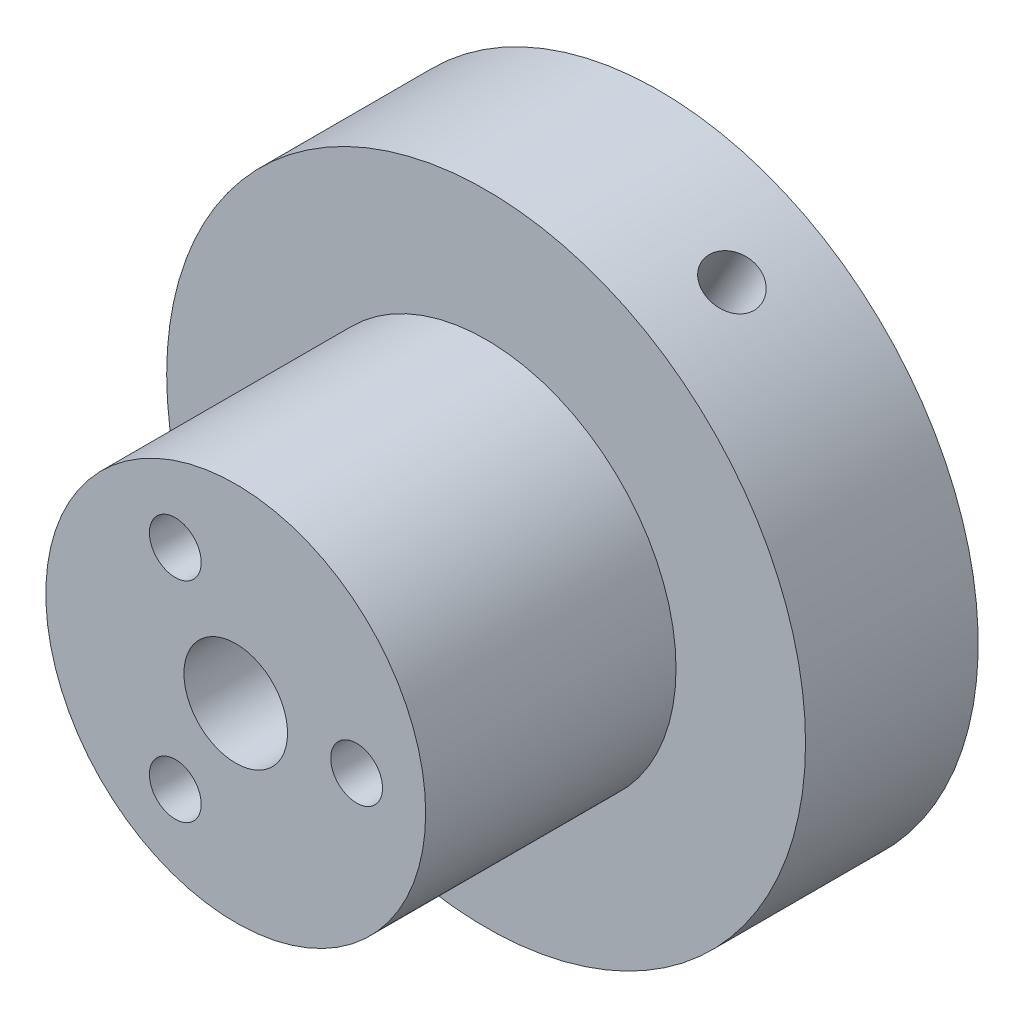
ISO-10303-21;
HEADER;
FILE_DESCRIPTION(('STEP AP214'),'2;1');
FILE_NAME('part.step','',(''),(''),'','','');
FILE_SCHEMA(('AUTOMOTIVE_DESIGN { 1 0 10303 214 1 1 1 1 }'));
ENDSEC;
DATA;
#1=APPLICATION_CONTEXT('core data for automotive mechanical design processes');
#2=APPLICATION_PROTOCOL_DEFINITION('international standard','automotive_design',2000,#1);
#3=PRODUCT_CONTEXT('',#1,'mechanical');
#4=PRODUCT('Part','Part','',(#3));
#5=PRODUCT_RELATED_PRODUCT_CATEGORY('part','',(#4));
#6=PRODUCT_DEFINITION_FORMATION('','',#4);
#7=PRODUCT_DEFINITION_CONTEXT('part definition',#1,'design');
#8=PRODUCT_DEFINITION('design','',#6,#7);
#9=PRODUCT_DEFINITION_SHAPE('','',#8);
#10=(LENGTH_UNIT() NAMED_UNIT(*) SI_UNIT(.MILLI.,.METRE.));
#11=(NAMED_UNIT(*) PLANE_ANGLE_UNIT() SI_UNIT($,.RADIAN.));
#12=(NAMED_UNIT(*) SI_UNIT($,.STERADIAN.) SOLID_ANGLE_UNIT());
#13=UNCERTAINTY_MEASURE_WITH_UNIT(LENGTH_MEASURE(1.E-05),#10,'distance_accuracy_value','');
#14=(GEOMETRIC_REPRESENTATION_CONTEXT(3) GLOBAL_UNCERTAINTY_ASSIGNED_CONTEXT((#13)) GLOBAL_UNIT_ASSIGNED_CONTEXT((#10,
#11,#12)) REPRESENTATION_CONTEXT('',''));
#15=CARTESIAN_POINT('',(0.,0.,0.));
#16=DIRECTION('',(0.,0.,1.));
#17=DIRECTION('',(1.,0.,0.));
#18=AXIS2_PLACEMENT_3D('',#15,#16,#17);
#19=CARTESIAN_POINT('',(-3.49999999999994,6.06217782649111,0.));
#20=DIRECTION('',(0.,0.,1.));
#21=DIRECTION('',(1.,0.,0.));
#22=AXIS2_PLACEMENT_3D('',#19,#20,#21);
#23=CYLINDRICAL_SURFACE('',#22,1.5);
#24=CARTESIAN_POINT('',(-3.49999999999994,6.06217782649111,17.5));
#25=DIRECTION('',(0.,0.,1.));
#26=DIRECTION('',(1.,0.,0.));
#27=AXIS2_PLACEMENT_3D('',#24,#25,#26);
#28=CIRCLE('',#27,1.5);
#29=CARTESIAN_POINT('',(-1.99999999999994,6.06217782649111,17.5));
#30=VERTEX_POINT('',#29);
#31=EDGE_CURVE('E200',#30,#30,#28,.T.);
#32=ORIENTED_EDGE('',*,*,#31,.T.);
#33=EDGE_LOOP('',(#32));
#34=FACE_BOUND('',#33,.T.);
#35=CARTESIAN_POINT('',(-3.49999999999994,6.06217782649111,10.));
#36=DIRECTION('',(0.,0.,-1.));
#37=DIRECTION('',(-1.,0.,0.));
#38=AXIS2_PLACEMENT_3D('',#35,#36,#37);
#39=CIRCLE('',#38,1.5);
#40=CARTESIAN_POINT('',(-4.99999999999994,6.06217782649111,10.));
#41=VERTEX_POINT('',#40);
#42=EDGE_CURVE('E79',#41,#41,#39,.F.);
#43=ORIENTED_EDGE('',*,*,#42,.F.);
#44=EDGE_LOOP('',(#43));
#45=FACE_BOUND('',#44,.T.);
#46=ADVANCED_FACE('F45',(#34,#45),#23,.F.);
#47=CARTESIAN_POINT('',(-3.50000000000003,-6.06217782649106,0.));
#48=DIRECTION('',(0.,0.,1.));
#49=DIRECTION('',(1.,0.,0.));
#50=AXIS2_PLACEMENT_3D('',#47,#48,#49);
#51=CYLINDRICAL_SURFACE('',#50,1.5);
#52=CARTESIAN_POINT('',(-3.50000000000003,-6.06217782649106,17.5));
#53=DIRECTION('',(0.,0.,1.));
#54=DIRECTION('',(1.,0.,0.));
#55=AXIS2_PLACEMENT_3D('',#52,#53,#54);
#56=CIRCLE('',#55,1.5);
#57=CARTESIAN_POINT('',(-2.00000000000003,-6.06217782649106,17.5));
#58=VERTEX_POINT('',#57);
#59=EDGE_CURVE('E206',#58,#58,#56,.T.);
#60=ORIENTED_EDGE('',*,*,#59,.T.);
#61=EDGE_LOOP('',(#60));
#62=FACE_BOUND('',#61,.T.);
#63=CARTESIAN_POINT('',(-3.50000000000003,-6.06217782649106,10.));
#64=DIRECTION('',(0.,0.,-1.));
#65=DIRECTION('',(-1.,0.,0.));
#66=AXIS2_PLACEMENT_3D('',#63,#64,#65);
#67=CIRCLE('',#66,1.5);
#68=CARTESIAN_POINT('',(-5.00000000000003,-6.06217782649106,10.));
#69=VERTEX_POINT('',#68);
#70=EDGE_CURVE('E74',#69,#69,#67,.F.);
#71=ORIENTED_EDGE('',*,*,#70,.F.);
#72=EDGE_LOOP('',(#71));
#73=FACE_BOUND('',#72,.T.);
#74=ADVANCED_FACE('F137',(#62,#73),#51,.F.);
#75=CARTESIAN_POINT('',(7.,0.,0.));
#76=DIRECTION('',(0.,0.,1.));
#77=DIRECTION('',(1.,0.,0.));
#78=AXIS2_PLACEMENT_3D('',#75,#76,#77);
#79=CYLINDRICAL_SURFACE('',#78,1.5);
#80=CARTESIAN_POINT('',(7.,0.,17.5));
#81=DIRECTION('',(0.,0.,1.));
#82=DIRECTION('',(1.,0.,0.));
#83=AXIS2_PLACEMENT_3D('',#80,#81,#82);
#84=CIRCLE('',#83,1.5);
#85=CARTESIAN_POINT('',(8.5,0.,17.5));
#86=VERTEX_POINT('',#85);
#87=EDGE_CURVE('E201',#86,#86,#84,.T.);
#88=ORIENTED_EDGE('',*,*,#87,.T.);
#89=EDGE_LOOP('',(#88));
#90=FACE_BOUND('',#89,.T.);
#91=CARTESIAN_POINT('',(7.,0.,10.));
#92=DIRECTION('',(0.,0.,-1.));
#93=DIRECTION('',(-1.,0.,0.));
#94=AXIS2_PLACEMENT_3D('',#91,#92,#93);
#95=CIRCLE('',#94,1.5);
#96=CARTESIAN_POINT('',(5.5,0.,10.));
#97=VERTEX_POINT('',#96);
#98=EDGE_CURVE('E70',#97,#97,#95,.F.);
#99=ORIENTED_EDGE('',*,*,#98,.F.);
#100=EDGE_LOOP('',(#99));
#101=FACE_BOUND('',#100,.T.);
#102=ADVANCED_FACE('F134',(#90,#101),#79,.F.);
#103=CARTESIAN_POINT('',(0.,0.,3.));
#104=DIRECTION('',(0.,0.,-1.));
#105=DIRECTION('',(-1.,0.,0.));
#106=AXIS2_PLACEMENT_3D('',#103,#104,#105);
#107=CYLINDRICAL_SURFACE('',#106,18.5);
#108=CARTESIAN_POINT('',(7.92050635161631,-16.7187194226713,-2.));
#109=CARTESIAN_POINT('',(7.920509940493,-16.7187182836103,-1.91589305238285));
#110=CARTESIAN_POINT('',(7.92694403159106,-16.7156742636564,-1.83172864688561));
#111=CARTESIAN_POINT('',(7.95249244942322,-16.7035342412793,-1.66572797712148));
#112=CARTESIAN_POINT('',(7.9716211916323,-16.6944313586494,-1.58389447002247));
#113=CARTESIAN_POINT('',(8.0219311386824,-16.6703147645035,-1.42498390631009));
#114=CARTESIAN_POINT('',(8.05310556804115,-16.6553043757654,-1.34790420398026));
#115=CARTESIAN_POINT('',(8.12650110386516,-16.6196160290497,-1.20064883417398));
#116=CARTESIAN_POINT('',(8.16871982826437,-16.5989392931607,-1.13047168242074));
#117=CARTESIAN_POINT('',(8.26298202865537,-16.5522171582038,-0.998823863895051));
#118=CARTESIAN_POINT('',(8.31504653305869,-16.5261602571446,-0.937372334215012));
#119=CARTESIAN_POINT('',(8.42732993336261,-16.4691853276837,-0.825084489746075));
#120=CARTESIAN_POINT('',(8.48754918334156,-16.4382670881938,-0.774248636132708));
#121=CARTESIAN_POINT('',(8.61439315523093,-16.3721515046297,-0.684571953396852));
#122=CARTESIAN_POINT('',(8.68102652188289,-16.3369483681291,-0.645747618398881));
#123=CARTESIAN_POINT('',(8.81862225676852,-16.2630867948194,-0.581301563704662));
#124=CARTESIAN_POINT('',(8.88958455280365,-16.2244284156325,-0.555679623884151));
#125=CARTESIAN_POINT('',(9.03357297272146,-16.1446992272974,-0.518420583859927));
#126=CARTESIAN_POINT('',(9.10659417234366,-16.1036339564812,-0.506752605386653));
#127=CARTESIAN_POINT('',(9.25272916089057,-16.0201149957479,-0.497637255511902));
#128=CARTESIAN_POINT('',(9.32584294815306,-15.9776613304262,-0.500189632332508));
#129=CARTESIAN_POINT('',(9.46991615707652,-15.8926922867784,-0.519417262399528));
#130=CARTESIAN_POINT('',(9.54088023810902,-15.8501772879836,-0.536059309799018));
#131=CARTESIAN_POINT('',(9.67888062735782,-15.7662866552721,-0.582942254568614));
#132=CARTESIAN_POINT('',(9.74591689989028,-15.7249110317084,-0.613183275462702));
#133=CARTESIAN_POINT('',(9.87434542109148,-15.6445854015982,-0.686442816683035));
#134=CARTESIAN_POINT('',(9.9357309814641,-15.6056382866286,-0.729476230001792));
#135=CARTESIAN_POINT('',(10.0511746963178,-15.5315356607769,-0.827088180090581));
#136=CARTESIAN_POINT('',(10.105232710188,-15.4963802226572,-0.881666938356818));
#137=CARTESIAN_POINT('',(10.2047926465065,-15.4310003661968,-1.00100748557717));
#138=CARTESIAN_POINT('',(10.2502695011575,-15.4007904279779,-1.06579812433811));
#139=CARTESIAN_POINT('',(10.331331866677,-15.3465295388471,-1.20362265870703));
#140=CARTESIAN_POINT('',(10.3669173700086,-15.3224785926281,-1.27665656059611));
#141=CARTESIAN_POINT('',(10.4273143197703,-15.281441555506,-1.42891454938799));
#142=CARTESIAN_POINT('',(10.4521245367051,-15.2644562708273,-1.50813934147531));
#143=CARTESIAN_POINT('',(10.4903467812982,-15.2382140238459,-1.67052066634596));
#144=CARTESIAN_POINT('',(10.5037590356439,-15.2289569078422,-1.75367712090002));
#145=CARTESIAN_POINT('',(10.5188301381156,-15.2185511087797,-1.92130804135632));
#146=CARTESIAN_POINT('',(10.5205223105851,-15.2173794359771,-2.00577808529532));
#147=CARTESIAN_POINT('',(10.5121995978079,-15.2231299082596,-2.17386086811142));
#148=CARTESIAN_POINT('',(10.5021848158491,-15.2300519819355,-2.25747361454572));
#149=CARTESIAN_POINT('',(10.47071850858,-15.2517020055878,-2.42135270374156));
#150=CARTESIAN_POINT('',(10.4492825572841,-15.2664193257319,-2.50162344337553));
#151=CARTESIAN_POINT('',(10.3955129021972,-15.3030834877141,-2.65667606888866));
#152=CARTESIAN_POINT('',(10.3631790327212,-15.3250304394668,-2.73145787129651));
#153=CARTESIAN_POINT('',(10.2883270996331,-15.3753815193488,-2.87359459297397));
#154=CARTESIAN_POINT('',(10.245786286936,-15.4038000639659,-2.94093242445872));
#155=CARTESIAN_POINT('',(10.1516190510955,-15.4660210479399,-3.0660970962305));
#156=CARTESIAN_POINT('',(10.0999924798696,-15.4998235750457,-3.12392378147214));
#157=CARTESIAN_POINT('',(9.9888272479967,-15.5716958909536,-3.22856224316261));
#158=CARTESIAN_POINT('',(9.92927027750794,-15.6097755219709,-3.27534781296246));
#159=CARTESIAN_POINT('',(9.80388522466343,-15.6888278642772,-3.35639621977992));
#160=CARTESIAN_POINT('',(9.73805720210339,-15.7298005479795,-3.39065917618804));
#161=CARTESIAN_POINT('',(9.60197050185944,-15.8132387544076,-3.44564467919343));
#162=CARTESIAN_POINT('',(9.53171725374305,-15.8557024204877,-3.46638347770085));
#163=CARTESIAN_POINT('',(9.38864013639583,-15.940839470571,-3.49378509166462));
#164=CARTESIAN_POINT('',(9.31581631299369,-15.9835128508236,-3.50044815793696));
#165=CARTESIAN_POINT('',(9.1698661448514,-16.0676890630386,-3.49950630926112));
#166=CARTESIAN_POINT('',(9.09674126656109,-16.1091949008849,-3.49194225635862));
#167=CARTESIAN_POINT('',(8.95208489584881,-16.19002914799,-3.46284603750625));
#168=CARTESIAN_POINT('',(8.88055340568351,-16.2293575541651,-3.44131385177489));
#169=CARTESIAN_POINT('',(8.74118322236748,-16.3048459586161,-3.38490284718542));
#170=CARTESIAN_POINT('',(8.67334434310311,-16.341006116633,-3.35002470169831));
#171=CARTESIAN_POINT('',(8.54337335935332,-16.4093317679929,-3.26791659890986));
#172=CARTESIAN_POINT('',(8.48124115766924,-16.441497329377,-3.22068685203921));
#173=CARTESIAN_POINT('',(8.3643953745659,-16.5012489116383,-3.11506295314024));
#174=CARTESIAN_POINT('',(8.3097025545615,-16.5288221627443,-3.05663861029896));
#175=CARTESIAN_POINT('',(8.20961014796169,-16.5787646995041,-2.93033750255217));
#176=CARTESIAN_POINT('',(8.16421281796173,-16.6011327217036,-2.86245844910254));
#177=CARTESIAN_POINT('',(8.08408209713078,-16.6403009474743,-2.71904972320095));
#178=CARTESIAN_POINT('',(8.04936799305311,-16.6570910854131,-2.6435065374776));
#179=CARTESIAN_POINT('',(7.99185990263305,-16.6847596075977,-2.48706416249895));
#180=CARTESIAN_POINT('',(7.96905218069001,-16.6956448045514,-2.4061712668252));
#181=CARTESIAN_POINT('',(7.94191399298116,-16.708564625058,-2.27066576296071));
#182=CARTESIAN_POINT('',(7.93389792917545,-16.712369648398,-2.21692522868833));
#183=CARTESIAN_POINT('',(7.92319295433397,-16.7174474124593,-2.1087978108073));
#184=CARTESIAN_POINT('',(7.92050402988047,-16.7187201595589,-2.05441092882698));
#185=CARTESIAN_POINT('',(7.92050635161631,-16.7187194226713,-2.));
#186=B_SPLINE_CURVE_WITH_KNOTS('',3,(#108,#109,#110,#111,#112,#113,#114,#115,#116,#117,#118,
#119,#120,#121,#122,#123,#124,#125,#126,#127,#128,#129,#130,#131,#132,#133,#134,#135,#136,#137,
#138,#139,#140,#141,#142,#143,#144,#145,#146,#147,#148,#149,#150,#151,#152,#153,#154,#155,#156,
#157,#158,#159,#160,#161,#162,#163,#164,#165,#166,#167,#168,#169,#170,#171,#172,#173,#174,#175,
#176,#177,#178,#179,#180,#181,#182,#183,#184,#185),.UNSPECIFIED.,.T.,.F.,(4,2,2,2,2,2,2,2,2,2,2,
2,2,2,2,2,2,2,2,2,2,2,2,2,2,2,2,2,2,2,2,2,2,2,2,2,2,2,4),(0.,0.252122182136554,
0.504531153893085,0.756798356335798,1.00901119384165,1.26176891370995,1.514537611818,
1.76765188493349,2.02076193772417,2.2733108489173,2.52585528863026,2.7778061954557,
3.02975939088097,3.28200706847211,3.53425958584686,3.78723796107974,4.04021652907545,
4.2932239551731,4.54622634923481,4.79850907147351,5.05078956789491,5.30272692938966,
5.55466812134959,5.80717613928723,6.05968827306149,6.31279386103382,6.56589703583611,
6.81869549463585,7.07148944877263,7.32355845589836,7.57562782000174,7.82768446761067,
8.07973682128258,8.33247875663575,8.58528197567228,8.83853894639373,9.09150310212679,
9.25460778074668,9.41771204854603),.UNSPECIFIED.);
#187=CARTESIAN_POINT('',(7.92050635161631,-16.7187194226713,-2.));
#188=VERTEX_POINT('',#187);
#189=EDGE_CURVE('E50',#188,#188,#186,.T.);
#190=ORIENTED_EDGE('',*,*,#189,.T.);
#191=EDGE_LOOP('',(#190));
#192=FACE_BOUND('',#191,.T.);
#193=CARTESIAN_POINT('',(10.5185825629694,15.2187194226714,-2.));
#194=CARTESIAN_POINT('',(10.5185797820753,15.2187219611993,-1.91589305238285));
#195=CARTESIAN_POINT('',(10.5127265379166,15.2227720375635,-1.83172864688561));
#196=CARTESIAN_POINT('',(10.4894387612194,15.2388276052441,-1.66572797712148));
#197=CARTESIAN_POINT('',(10.4719910625097,15.2508421406247,-1.58389447002247));
#198=CARTESIAN_POINT('',(10.4259505058016,15.2823535357602,-1.42498390631009));
#199=CARTESIAN_POINT('',(10.3973639131543,15.3018461891643,-1.34790420398026));
#200=CARTESIAN_POINT('',(10.3297591303674,15.3475644143544,-1.20064883417398));
#201=CARTESIAN_POINT('',(10.2907431896206,15.373788534255,-1.13047168242074));
#202=CARTESIAN_POINT('',(10.2031495336334,15.4320609269318,-0.998823863895052));
#203=CARTESIAN_POINT('',(10.1545513431705,15.4641216598509,-0.937372334215012));
#204=CARTESIAN_POINT('',(10.0490679067266,15.5328744722069,-0.825084489746075));
#205=CARTESIAN_POINT('',(9.99218230089864,15.5695667527406,-0.774248636132708));
#206=CARTESIAN_POINT('',(9.87150254000142,15.6463590629317,-0.684571953396852));
#207=CARTESIAN_POINT('',(9.80769904617297,15.6864636829416,-0.645747618398881));
#208=CARTESIAN_POINT('',(9.67493517988051,15.7686942981501,-0.581301563704663));
#209=CARTESIAN_POINT('',(9.60597489341794,15.810820259634,-0.555679623884151));
#210=CARTESIAN_POINT('',(9.46493318093773,15.895653294966,-0.518420583859926));
#211=CARTESIAN_POINT('',(9.39285901338653,15.9383588734456,-0.506752605386652));
#212=CARTESIAN_POINT('',(9.24746197742036,16.0231560055423,-0.497637255511902));
#213=CARTESIAN_POINT('',(9.17413913113674,16.0652475700176,-0.500189632332508));
#214=CARTESIAN_POINT('',(9.02851717634079,16.1475341071262,-0.519417262399528));
#215=CARTESIAN_POINT('',(8.95621606682639,16.1877333046592,-0.536059309799018));
#216=CARTESIAN_POINT('',(8.81456445313428,16.265299831125,-0.582942254568613));
#217=CARTESIAN_POINT('',(8.74521397576441,16.3026671343313,-0.613183275462701));
#218=CARTESIAN_POINT('',(8.6114356789134,16.3737266812069,-0.686442816683035));
#219=CARTESIAN_POINT('',(8.54701370775933,16.4074145784304,-0.729476230001792));
#220=CARTESIAN_POINT('',(8.42511709385775,16.470340455275,-0.827088180090581));
#221=CARTESIAN_POINT('',(8.3676425844298,16.499578349505,-0.881666938356817));
#222=CARTESIAN_POINT('',(8.26124199968003,16.5531098553257,-1.00100748557716));
#223=CARTESIAN_POINT('',(8.21234099841028,16.5773889976282,-1.06579812433811));
#224=CARTESIAN_POINT('',(8.12481850723128,16.6204606208936,-1.20362265870703));
#225=CARTESIAN_POINT('',(8.08619702515477,16.6392530976757,-1.27665656059611));
#226=CARTESIAN_POINT('',(8.02045943363014,16.6710398719194,-1.42891454938799));
#227=CARTESIAN_POINT('',(7.9933446371405,16.684033507719,-1.50813934147531));
#228=CARTESIAN_POINT('',(7.95150706230569,16.7040138190355,-1.67052066634596));
#229=CARTESIAN_POINT('',(7.93678403750782,16.7110006140191,-1.75367712090002));
#230=CARTESIAN_POINT('',(7.92023679993723,16.7188496720914,-1.92130804135632));
#231=CARTESIAN_POINT('',(7.91837601529046,16.7197293000362,-2.00577808529532));
#232=CARTESIAN_POINT('',(7.92751742675949,16.7153968554841,-2.17386086811143));
#233=CARTESIAN_POINT('',(7.93851950938908,16.7101848367323,-2.25747361454572));
#234=CARTESIAN_POINT('',(7.97300213349905,16.6937592271001,-2.42135270374156));
#235=CARTESIAN_POINT('',(7.99646568226737,16.6825538087956,-2.50162344337553));
#236=CARTESIAN_POINT('',(8.05510260549592,16.6543200025287,-2.65667606888866));
#237=CARTESIAN_POINT('',(8.09027615798736,16.6372915260363,-2.73145787129651));
#238=CARTESIAN_POINT('',(8.17130743881718,16.5976433904006,-2.87359459297397));
#239=CARTESIAN_POINT('',(8.21718902674273,16.5750112382158,-2.94093242445872));
#240=CARTESIAN_POINT('',(8.31815759743289,16.5245705117608,-3.0660970962305));
#241=CARTESIAN_POINT('',(8.37324473023163,16.4967618531218,-3.12392378147214));
#242=CARTESIAN_POINT('',(8.49107059757317,16.4364260962562,-3.22856224316261));
#243=CARTESIAN_POINT('',(8.55382701064521,16.4038880623491,-3.27534781296246));
#244=CARTESIAN_POINT('',(8.68498087373343,16.3348275924841,-3.35639621977992));
#245=CARTESIAN_POINT('',(8.75337826996087,16.2983051945173,-3.39065917618804));
#246=CARTESIAN_POINT('',(8.89368122649581,16.2221697582029,-3.44564467919343));
#247=CARTESIAN_POINT('',(8.9655824641172,16.1825604936758,-3.46638347770085));
#248=CARTESIAN_POINT('',(9.11085187096617,16.1012206003945,-3.49378509166462));
#249=CARTESIAN_POINT('',(9.18422001403139,16.0594900094539,-3.50044815793696));
#250=CARTESIAN_POINT('',(9.33009383627505,15.9751815622635,-3.49950630926112));
#251=CARTESIAN_POINT('',(9.40260138540043,15.9326064789386,-3.49194225635862));
#252=CARTESIAN_POINT('',(9.54493408224539,15.8477475106351,-3.46284603750625));
#253=CARTESIAN_POINT('',(9.61475922616602,15.8054636260689,-3.44131385177489));
#254=CARTESIAN_POINT('',(9.74981919376976,15.7225097090126,-3.38490284718542));
#255=CARTESIAN_POINT('',(9.81505424884944,15.6818395952139,-3.35002470169831));
#256=CARTESIAN_POINT('',(9.93921149053217,15.6034442472117,-3.26791659890986));
#257=CARTESIAN_POINT('',(9.9981337846598,15.5657189628522,-3.2206868520392));
#258=CARTESIAN_POINT('',(10.1083030643661,15.4944033374903,-3.11506295314024));
#259=CARTESIAN_POINT('',(10.159528610291,15.4608245915149,-3.05663861029896));
#260=CARTESIAN_POINT('',(10.2528263191543,15.3991132930535,-2.93033750255217));
#261=CARTESIAN_POINT('',(10.2948962596115,15.3709820631093,-2.86245844910254));
#262=CARTESIAN_POINT('',(10.3688822985656,15.3211709361314,-2.71904972320095));
#263=CARTESIAN_POINT('',(10.4007800365924,15.2995027090999,-2.6435065374776));
#264=CARTESIAN_POINT('',(10.4534957248995,15.2635335029653,-2.48706416249895));
#265=CARTESIAN_POINT('',(10.4743264429581,15.2492240348371,-2.40617126682519));
#266=CARTESIAN_POINT('',(10.4990844295836,15.2321815851218,-2.27066576296071));
#267=CARTESIAN_POINT('',(10.5063877083609,15.2271419818977,-2.21692522868833));
#268=CARTESIAN_POINT('',(10.5161376684532,15.2204100837688,-2.1087978108073));
#269=CARTESIAN_POINT('',(10.5185843620007,15.218717780433,-2.05441092882698));
#270=CARTESIAN_POINT('',(10.5185825629694,15.2187194226714,-2.));
#271=B_SPLINE_CURVE_WITH_KNOTS('',3,(#193,#194,#195,#196,#197,#198,#199,#200,#201,#202,#203,
#204,#205,#206,#207,#208,#209,#210,#211,#212,#213,#214,#215,#216,#217,#218,#219,#220,#221,#222,
#223,#224,#225,#226,#227,#228,#229,#230,#231,#232,#233,#234,#235,#236,#237,#238,#239,#240,#241,
#242,#243,#244,#245,#246,#247,#248,#249,#250,#251,#252,#253,#254,#255,#256,#257,#258,#259,#260,
#261,#262,#263,#264,#265,#266,#267,#268,#269,#270),.UNSPECIFIED.,.T.,.F.,(4,2,2,2,2,2,2,2,2,2,2,
2,2,2,2,2,2,2,2,2,2,2,2,2,2,2,2,2,2,2,2,2,2,2,2,2,2,2,4),(0.,0.252122182136554,
0.504531153893085,0.756798356335799,1.00901119384165,1.26176891370994,1.514537611818,
1.76765188493349,2.02076193772417,2.2733108489173,2.52585528863026,2.7778061954557,
3.02975939088097,3.2820070684721,3.53425958584686,3.78723796107974,4.04021652907545,
4.2932239551731,4.54622634923481,4.79850907147351,5.05078956789491,5.30272692938966,
5.55466812134959,5.80717613928722,6.05968827306148,6.31279386103382,6.5658970358361,
6.81869549463585,7.07148944877263,7.32355845589836,7.57562782000174,7.82768446761067,
8.07973682128258,8.33247875663574,8.58528197567228,8.83853894639373,9.09150310212679,
9.25460778074668,9.41771204854603),.UNSPECIFIED.);
#272=CARTESIAN_POINT('',(10.5185825629694,15.2187194226714,-2.));
#273=VERTEX_POINT('',#272);
#274=EDGE_CURVE('E93',#273,#273,#271,.T.);
#275=ORIENTED_EDGE('',*,*,#274,.T.);
#276=EDGE_LOOP('',(#275));
#277=FACE_BOUND('',#276,.T.);
#278=CARTESIAN_POINT('',(-18.5,0.,-0.5));
#279=CARTESIAN_POINT('',(-18.4999992018386,-0.0841074600240858,-0.500003677126893));
#280=CARTESIAN_POINT('',(-18.49942031025,-0.168272376255621,-0.507097856961772));
#281=CARTESIAN_POINT('',(-18.4971666549999,-0.334274107221221,-0.535293808922717));
#282=CARTESIAN_POINT('',(-18.4954906456848,-0.416108165187959,-0.556411503564231));
#283=CARTESIAN_POINT('',(-18.4912321771331,-0.575019893548109,-0.61204030213125));
#284=CARTESIAN_POINT('',(-18.488650226645,-0.652100204992827,-0.646543890100829));
#285=CARTESIAN_POINT('',(-18.4828695305308,-0.799356594754252,-0.72795174726246));
#286=CARTESIAN_POINT('',(-18.4796709180124,-0.869534158112596,-0.774853341133831));
#287=CARTESIAN_POINT('',(-18.4730072385833,-1.00118150919002,-0.879848613224292));
#288=CARTESIAN_POINT('',(-18.4695416147041,-1.06263229082474,-0.937966088789517));
#289=CARTESIAN_POINT('',(-18.4627391922885,-1.17491869232043,-1.06369320005692));
#290=CARTESIAN_POINT('',(-18.4594023993818,-1.2257538487126,-1.13130324998106));
#291=CARTESIAN_POINT('',(-18.4532293906448,-1.31542980445019,-1.27421073449909));
#292=CARTESIAN_POINT('',(-18.4503938708621,-1.35425398103888,-1.34951863269072));
#293=CARTESIAN_POINT('',(-18.4455507283819,-1.41869970374439,-1.50561112922273));
#294=CARTESIAN_POINT('',(-18.4435430917625,-1.44432147188073,-1.58639563543936));
#295=CARTESIAN_POINT('',(-18.4405876379152,-1.48158015006174,-1.7509583551443));
#296=CARTESIAN_POINT('',(-18.4396374820103,-1.49324792441559,-1.83472953794888));
#297=CARTESIAN_POINT('',(-18.4388971512574,-1.50236275051092,-2.0030462829829));
#298=CARTESIAN_POINT('',(-18.4391069556935,-1.49981005621559,-2.08759183135603));
#299=CARTESIAN_POINT('',(-18.440660717717,-1.48058192581961,-2.25484600580532));
#300=CARTESIAN_POINT('',(-18.4420019829606,-1.46394001507811,-2.33755851457945));
#301=CARTESIAN_POINT('',(-18.4456633111963,-1.41705792947881,-2.49901236912521));
#302=CARTESIAN_POINT('',(-18.4479833833004,-1.38681762802737,-2.57775367791953));
#303=CARTESIAN_POINT('',(-18.4533440042758,-1.3135595716986,-2.7291369025526));
#304=CARTESIAN_POINT('',(-18.456385401562,-1.27052675518137,-2.80177149843279));
#305=CARTESIAN_POINT('',(-18.4628451854293,-1.17291607630135,-2.93879942206624));
#306=CARTESIAN_POINT('',(-18.4662635792315,-1.11833799277576,-3.00319259190761));
#307=CARTESIAN_POINT('',(-18.4731041550355,-0.998997921290517,-3.12210472497058));
#308=CARTESIAN_POINT('',(-18.4765263194163,-0.934206946496951,-3.17659460229634));
#309=CARTESIAN_POINT('',(-18.4829794102491,-0.796381456947068,-3.27392856181887));
#310=CARTESIAN_POINT('',(-18.4860103364576,-0.723346937060889,-3.31677263676854));
#311=CARTESIAN_POINT('',(-18.4913399763367,-0.571088786957947,-3.38959691604859));
#312=CARTESIAN_POINT('',(-18.4936386179699,-0.491864548790936,-3.4195758548911));
#313=CARTESIAN_POINT('',(-18.4972438513764,-0.329484427021322,-3.46579861992925));
#314=CARTESIAN_POINT('',(-18.4985504626397,-0.246328620694753,-3.48204271596854));
#315=CARTESIAN_POINT('',(-18.5000219120631,-0.078697992068915,-3.50029827017414));
#316=CARTESIAN_POINT('',(-18.5001899735125,0.00577242742720614,-3.50234990822105));
#317=CARTESIAN_POINT('',(-18.4993739916585,0.173856042607109,-3.49226753191298));
#318=CARTESIAN_POINT('',(-18.4983899585204,0.257469245847823,-3.4801336427215));
#319=CARTESIAN_POINT('',(-18.495382540036,0.421350558055178,-3.44205794682921));
#320=CARTESIAN_POINT('',(-18.4933605549502,0.501623016566481,-3.41613474105266));
#321=CARTESIAN_POINT('',(-18.4885044160699,0.656678872821625,-3.35123526186494));
#322=CARTESIAN_POINT('',(-18.4856702500991,0.731462188249673,-3.31225879275434));
#323=CARTESIAN_POINT('',(-18.4794995137225,0.873599925942357,-3.22225805364098));
#324=CARTESIAN_POINT('',(-18.4761618381982,0.940937428102478,-3.17120713873549));
#325=CARTESIAN_POINT('',(-18.4693628625451,1.06610133368472,-3.05854518129713));
#326=CARTESIAN_POINT('',(-18.4659015603836,1.12392758063525,-2.99693396506863));
#327=CARTESIAN_POINT('',(-18.4592359229661,1.22856511642573,-2.86472608670604));
#328=CARTESIAN_POINT('',(-18.4560322106203,1.27535020395855,-2.79410865147966));
#329=CARTESIAN_POINT('',(-18.4502531976971,1.35639776419443,-2.64599642528607));
#330=CARTESIAN_POINT('',(-18.4476778911333,1.39066035619648,-2.56850169984599));
#331=CARTESIAN_POINT('',(-18.4434506960258,1.44564561352028,-2.40892781502757));
#332=CARTESIAN_POINT('',(-18.4417977102096,1.46638437294225,-2.32685423153443));
#333=CARTESIAN_POINT('',(-18.4395985923444,1.49378568743103,-2.16037591293555));
#334=CARTESIAN_POINT('',(-18.4390524402998,1.5004484967879,-2.07597121997053));
#335=CARTESIAN_POINT('',(-18.439129098025,1.4995059076103,-1.90748701844209));
#336=CARTESIAN_POINT('',(-18.4397485348113,1.49194167933729,-1.82340727494692));
#337=CARTESIAN_POINT('',(-18.4420794105417,1.46284552444752,-1.65771645815518));
#338=CARTESIAN_POINT('',(-18.443790851196,1.44131357595534,-1.57610538872511));
#339=CARTESIAN_POINT('',(-18.4481120145893,1.38490349674601,-1.41766548330881));
#340=CARTESIAN_POINT('',(-18.4507216915667,1.35002604592053,-1.34083640393408));
#341=CARTESIAN_POINT('',(-18.4565453445918,1.26791970089686,-1.19411749893485));
#342=CARTESIAN_POINT('',(-18.459759310408,1.22069101582014,-1.12422755584993));
#343=CARTESIAN_POINT('',(-18.4664404468683,1.1150682747765,-0.993160271760561));
#344=CARTESIAN_POINT('',(-18.4699082913633,1.05664378585471,-0.932007490158073));
#345=CARTESIAN_POINT('',(-18.4767003111364,0.930342064543587,-0.820352140426872));
#346=CARTESIAN_POINT('',(-18.4800244514024,0.862462545344835,-0.769852156253509));
#347=CARTESIAN_POINT('',(-18.4861601929444,0.719053450028474,-0.680872027125138));
#348=CARTESIAN_POINT('',(-18.4889708694003,0.643510444069051,-0.642413483285792));
#349=CARTESIAN_POINT('',(-18.4937520078942,0.487068452403801,-0.578775370558669));
#350=CARTESIAN_POINT('',(-18.4957234374669,0.406175759180912,-0.553580502522848));
#351=CARTESIAN_POINT('',(-18.4980965732538,0.270669711012243,-0.523617652854907));
#352=CARTESIAN_POINT('',(-18.4988071182786,0.216928388993599,-0.514772765628119));
#353=CARTESIAN_POINT('',(-18.4997590892453,0.108799392427557,-0.502962757097845));
#354=CARTESIAN_POINT('',(-18.5000005163553,0.0544117194900211,-0.499997621152785));
#355=CARTESIAN_POINT('',(-18.5,0.,-0.5));
#356=B_SPLINE_CURVE_WITH_KNOTS('',3,(#278,#279,#280,#281,#282,#283,#284,#285,#286,#287,#288,
#289,#290,#291,#292,#293,#294,#295,#296,#297,#298,#299,#300,#301,#302,#303,#304,#305,#306,#307,
#308,#309,#310,#311,#312,#313,#314,#315,#316,#317,#318,#319,#320,#321,#322,#323,#324,#325,#326,
#327,#328,#329,#330,#331,#332,#333,#334,#335,#336,#337,#338,#339,#340,#341,#342,#343,#344,#345,
#346,#347,#348,#349,#350,#351,#352,#353,#354,#355),.UNSPECIFIED.,.T.,.F.,(4,2,2,2,2,2,2,2,2,2,2,
2,2,2,2,2,2,2,2,2,2,2,2,2,2,2,2,2,2,2,2,2,2,2,2,2,2,2,4),(0.,0.252123721168803,
0.504534198083481,0.75680315536181,1.00901772081216,1.26177342695931,1.51454016589054,
1.76765517578223,2.02076592900327,2.27331579457328,2.52586114987229,2.77780725581025,
3.02975570727832,3.28200198044324,3.53425308611153,3.78723348355258,4.04021403842129,
4.29321947219408,4.54621993514242,4.79850384117442,5.05078552124028,5.30272774893383,
5.55467375400919,5.80718100738505,6.05969241439369,6.31279715184359,6.56589947795907,
6.81870004610704,7.07149604722958,7.32356163154415,7.57562761062996,7.82768074982833,
8.07972962173552,8.33247360074612,8.58527881532491,8.83853497220858,9.09149836408137,
9.2546054101218,9.4177120499976),.UNSPECIFIED.);
#357=CARTESIAN_POINT('',(-18.5,0.,-0.5));
#358=VERTEX_POINT('',#357);
#359=EDGE_CURVE('E84',#358,#358,#356,.T.);
#360=ORIENTED_EDGE('',*,*,#359,.T.);
#361=EDGE_LOOP('',(#360));
#362=FACE_BOUND('',#361,.T.);
#363=CARTESIAN_POINT('',(0.,0.,3.));
#364=DIRECTION('',(0.,0.,1.));
#365=DIRECTION('',(1.,0.,0.));
#366=AXIS2_PLACEMENT_3D('',#363,#364,#365);
#367=CIRCLE('',#366,18.5);
#368=CARTESIAN_POINT('',(18.5,0.,3.));
#369=VERTEX_POINT('',#368);
#370=EDGE_CURVE('E59',#369,#369,#367,.T.);
#371=ORIENTED_EDGE('',*,*,#370,.F.);
#372=EDGE_LOOP('',(#371));
#373=FACE_BOUND('',#372,.T.);
#374=CARTESIAN_POINT('',(0.,0.,-7.));
#375=DIRECTION('',(0.,0.,-1.));
#376=DIRECTION('',(-1.,0.,0.));
#377=AXIS2_PLACEMENT_3D('',#374,#375,#376);
#378=CIRCLE('',#377,18.5);
#379=CARTESIAN_POINT('',(-18.5,0.,-7.));
#380=VERTEX_POINT('',#379);
#381=EDGE_CURVE('E175',#380,#380,#378,.T.);
#382=ORIENTED_EDGE('',*,*,#381,.F.);
#383=EDGE_LOOP('',(#382));
#384=FACE_BOUND('',#383,.T.);
#385=ADVANCED_FACE('F47',(#192,#277,#362,#373,#384),#107,.T.);
#386=CARTESIAN_POINT('',(0.,0.,3.));
#387=DIRECTION('',(0.,0.,1.));
#388=DIRECTION('',(1.,0.,0.));
#389=AXIS2_PLACEMENT_3D('',#386,#387,#388);
#390=PLANE('',#389);
#391=CARTESIAN_POINT('',(0.,0.,3.));
#392=DIRECTION('',(0.,0.,1.));
#393=DIRECTION('',(1.,0.,0.));
#394=AXIS2_PLACEMENT_3D('',#391,#392,#393);
#395=CIRCLE('',#394,11.);
#396=CARTESIAN_POINT('',(11.,0.,3.));
#397=VERTEX_POINT('',#396);
#398=EDGE_CURVE('E11',#397,#397,#395,.T.);
#399=ORIENTED_EDGE('',*,*,#398,.F.);
#400=EDGE_LOOP('',(#399));
#401=FACE_BOUND('',#400,.T.);
#402=ORIENTED_EDGE('',*,*,#370,.T.);
#403=EDGE_LOOP('',(#402));
#404=FACE_BOUND('',#403,.T.);
#405=ADVANCED_FACE('F162',(#401,#404),#390,.T.);
#406=CARTESIAN_POINT('',(0.,0.,6.5));
#407=DIRECTION('',(0.,0.,-1.));
#408=DIRECTION('',(-1.,0.,0.));
#409=AXIS2_PLACEMENT_3D('',#406,#407,#408);
#410=CYLINDRICAL_SURFACE('',#409,11.);
#411=ORIENTED_EDGE('',*,*,#398,.T.);
#412=EDGE_LOOP('',(#411));
#413=FACE_BOUND('',#412,.T.);
#414=CARTESIAN_POINT('',(0.,0.,17.5));
#415=DIRECTION('',(0.,0.,1.));
#416=DIRECTION('',(1.,0.,0.));
#417=AXIS2_PLACEMENT_3D('',#414,#415,#416);
#418=CIRCLE('',#417,11.);
#419=CARTESIAN_POINT('',(11.,0.,17.5));
#420=VERTEX_POINT('',#419);
#421=EDGE_CURVE('E215',#420,#420,#418,.T.);
#422=ORIENTED_EDGE('',*,*,#421,.F.);
#423=EDGE_LOOP('',(#422));
#424=FACE_BOUND('',#423,.T.);
#425=ADVANCED_FACE('F159',(#413,#424),#410,.T.);
#426=CARTESIAN_POINT('',(0.,0.,4.1));
#427=DIRECTION('',(0.,0.,-1.));
#428=DIRECTION('',(-1.,0.,0.));
#429=AXIS2_PLACEMENT_3D('',#426,#427,#428);
#430=CYLINDRICAL_SURFACE('',#429,3.05);
#431=CARTESIAN_POINT('',(0.,0.,4.1));
#432=DIRECTION('',(0.,0.,-1.));
#433=DIRECTION('',(-1.,0.,0.));
#434=AXIS2_PLACEMENT_3D('',#431,#432,#433);
#435=CIRCLE('',#434,3.05);
#436=CARTESIAN_POINT('',(-3.05,0.,4.1));
#437=VERTEX_POINT('',#436);
#438=EDGE_CURVE('E65',#437,#437,#435,.T.);
#439=ORIENTED_EDGE('',*,*,#438,.F.);
#440=EDGE_LOOP('',(#439));
#441=FACE_BOUND('',#440,.T.);
#442=CARTESIAN_POINT('',(0.,0.,-7.));
#443=DIRECTION('',(0.,0.,-1.));
#444=DIRECTION('',(-1.,0.,0.));
#445=AXIS2_PLACEMENT_3D('',#442,#443,#444);
#446=CIRCLE('',#445,3.05);
#447=CARTESIAN_POINT('',(-3.05,0.,-7.));
#448=VERTEX_POINT('',#447);
#449=EDGE_CURVE('E91',#448,#448,#446,.T.);
#450=ORIENTED_EDGE('',*,*,#449,.T.);
#451=EDGE_LOOP('',(#450));
#452=FACE_BOUND('',#451,.T.);
#453=ADVANCED_FACE('F155',(#441,#452),#430,.F.);
#454=CARTESIAN_POINT('',(0.,0.,4.1));
#455=DIRECTION('',(0.,0.,-1.));
#456=DIRECTION('',(-1.,0.,0.));
#457=AXIS2_PLACEMENT_3D('',#454,#455,#456);
#458=PLANE('',#457);
#459=CARTESIAN_POINT('',(0.,0.,4.1));
#460=DIRECTION('',(0.,0.,-1.));
#461=DIRECTION('',(-1.,0.,0.));
#462=AXIS2_PLACEMENT_3D('',#459,#460,#461);
#463=CIRCLE('',#462,3.);
#464=CARTESIAN_POINT('',(-3.,0.,4.1));
#465=VERTEX_POINT('',#464);
#466=EDGE_CURVE('E83',#465,#465,#463,.T.);
#467=ORIENTED_EDGE('',*,*,#466,.F.);
#468=EDGE_LOOP('',(#467));
#469=FACE_BOUND('',#468,.T.);
#470=ORIENTED_EDGE('',*,*,#438,.T.);
#471=EDGE_LOOP('',(#470));
#472=FACE_BOUND('',#471,.T.);
#473=ADVANCED_FACE('F151',(#469,#472),#458,.T.);
#474=CARTESIAN_POINT('',(0.,0.,17.5));
#475=DIRECTION('',(0.,0.,1.));
#476=DIRECTION('',(1.,0.,0.));
#477=AXIS2_PLACEMENT_3D('',#474,#475,#476);
#478=PLANE('',#477);
#479=ORIENTED_EDGE('',*,*,#87,.F.);
#480=EDGE_LOOP('',(#479));
#481=FACE_BOUND('',#480,.T.);
#482=ORIENTED_EDGE('',*,*,#59,.F.);
#483=EDGE_LOOP('',(#482));
#484=FACE_BOUND('',#483,.T.);
#485=ORIENTED_EDGE('',*,*,#31,.F.);
#486=EDGE_LOOP('',(#485));
#487=FACE_BOUND('',#486,.T.);
#488=ORIENTED_EDGE('',*,*,#421,.T.);
#489=EDGE_LOOP('',(#488));
#490=FACE_BOUND('',#489,.T.);
#491=CARTESIAN_POINT('',(0.,0.,17.5));
#492=DIRECTION('',(0.,0.,1.));
#493=DIRECTION('',(1.,0.,0.));
#494=AXIS2_PLACEMENT_3D('',#491,#492,#493);
#495=CIRCLE('',#494,3.);
#496=CARTESIAN_POINT('',(3.,0.,17.5));
#497=VERTEX_POINT('',#496);
#498=EDGE_CURVE('E205',#497,#497,#495,.T.);
#499=ORIENTED_EDGE('',*,*,#498,.F.);
#500=EDGE_LOOP('',(#499));
#501=FACE_BOUND('',#500,.T.);
#502=ADVANCED_FACE('F147',(#481,#484,#487,#490,#501),#478,.T.);
#503=CARTESIAN_POINT('',(0.,0.,17.5));
#504=DIRECTION('',(0.,0.,-1.));
#505=DIRECTION('',(-1.,0.,0.));
#506=AXIS2_PLACEMENT_3D('',#503,#504,#505);
#507=CYLINDRICAL_SURFACE('',#506,3.);
#508=ORIENTED_EDGE('',*,*,#498,.T.);
#509=EDGE_LOOP('',(#508));
#510=FACE_BOUND('',#509,.T.);
#511=ORIENTED_EDGE('',*,*,#466,.T.);
#512=EDGE_LOOP('',(#511));
#513=FACE_BOUND('',#512,.T.);
#514=ADVANCED_FACE('F122',(#510,#513),#507,.F.);
#515=CARTESIAN_POINT('',(7.,0.,10.));
#516=DIRECTION('',(0.,0.,-1.));
#517=DIRECTION('',(-1.,0.,0.));
#518=AXIS2_PLACEMENT_3D('',#515,#516,#517);
#519=PLANE('',#518);
#520=CARTESIAN_POINT('',(7.,0.,10.));
#521=DIRECTION('',(0.,0.,-1.));
#522=DIRECTION('',(-1.,0.,0.));
#523=AXIS2_PLACEMENT_3D('',#520,#521,#522);
#524=CIRCLE('',#523,3.25);
#525=CARTESIAN_POINT('',(3.75,0.,10.));
#526=VERTEX_POINT('',#525);
#527=EDGE_CURVE('E178',#526,#526,#524,.T.);
#528=ORIENTED_EDGE('',*,*,#527,.T.);
#529=EDGE_LOOP('',(#528));
#530=FACE_BOUND('',#529,.T.);
#531=ORIENTED_EDGE('',*,*,#98,.T.);
#532=EDGE_LOOP('',(#531));
#533=FACE_BOUND('',#532,.T.);
#534=ADVANCED_FACE('F118',(#530,#533),#519,.T.);
#535=CARTESIAN_POINT('',(7.,0.,10.));
#536=DIRECTION('',(0.,0.,-1.));
#537=DIRECTION('',(-1.,0.,0.));
#538=AXIS2_PLACEMENT_3D('',#535,#536,#537);
#539=CYLINDRICAL_SURFACE('',#538,3.25);
#540=ORIENTED_EDGE('',*,*,#527,.F.);
#541=EDGE_LOOP('',(#540));
#542=FACE_BOUND('',#541,.T.);
#543=CARTESIAN_POINT('',(7.,0.,-7.));
#544=DIRECTION('',(0.,0.,-1.));
#545=DIRECTION('',(-1.,0.,0.));
#546=AXIS2_PLACEMENT_3D('',#543,#544,#545);
#547=CIRCLE('',#546,3.25);
#548=CARTESIAN_POINT('',(3.75,0.,-7.));
#549=VERTEX_POINT('',#548);
#550=EDGE_CURVE('E229',#549,#549,#547,.T.);
#551=ORIENTED_EDGE('',*,*,#550,.T.);
#552=EDGE_LOOP('',(#551));
#553=FACE_BOUND('',#552,.T.);
#554=ADVANCED_FACE('F121',(#542,#553),#539,.F.);
#555=CARTESIAN_POINT('',(-3.50000000000003,-6.06217782649106,10.));
#556=DIRECTION('',(0.,0.,-1.));
#557=DIRECTION('',(-1.,0.,0.));
#558=AXIS2_PLACEMENT_3D('',#555,#556,#557);
#559=PLANE('',#558);
#560=CARTESIAN_POINT('',(-3.50000000000003,-6.06217782649106,10.));
#561=DIRECTION('',(0.,0.,-1.));
#562=DIRECTION('',(-1.,0.,0.));
#563=AXIS2_PLACEMENT_3D('',#560,#561,#562);
#564=CIRCLE('',#563,3.25);
#565=CARTESIAN_POINT('',(-6.75000000000003,-6.06217782649106,10.));
#566=VERTEX_POINT('',#565);
#567=EDGE_CURVE('E75',#566,#566,#564,.T.);
#568=ORIENTED_EDGE('',*,*,#567,.T.);
#569=EDGE_LOOP('',(#568));
#570=FACE_BOUND('',#569,.T.);
#571=ORIENTED_EDGE('',*,*,#70,.T.);
#572=EDGE_LOOP('',(#571));
#573=FACE_BOUND('',#572,.T.);
#574=ADVANCED_FACE('F126',(#570,#573),#559,.T.);
#575=CARTESIAN_POINT('',(-3.50000000000003,-6.06217782649106,10.));
#576=DIRECTION('',(0.,0.,-1.));
#577=DIRECTION('',(-1.,0.,0.));
#578=AXIS2_PLACEMENT_3D('',#575,#576,#577);
#579=CYLINDRICAL_SURFACE('',#578,3.25);
#580=ORIENTED_EDGE('',*,*,#567,.F.);
#581=EDGE_LOOP('',(#580));
#582=FACE_BOUND('',#581,.T.);
#583=CARTESIAN_POINT('',(-3.50000000000003,-6.06217782649106,-7.));
#584=DIRECTION('',(0.,0.,-1.));
#585=DIRECTION('',(-1.,0.,0.));
#586=AXIS2_PLACEMENT_3D('',#583,#584,#585);
#587=CIRCLE('',#586,3.25);
#588=CARTESIAN_POINT('',(-6.75000000000003,-6.06217782649106,-7.));
#589=VERTEX_POINT('',#588);
#590=EDGE_CURVE('E187',#589,#589,#587,.T.);
#591=ORIENTED_EDGE('',*,*,#590,.T.);
#592=EDGE_LOOP('',(#591));
#593=FACE_BOUND('',#592,.T.);
#594=ADVANCED_FACE('F113',(#582,#593),#579,.F.);
#595=CARTESIAN_POINT('',(-3.49999999999994,6.06217782649111,10.));
#596=DIRECTION('',(0.,0.,-1.));
#597=DIRECTION('',(-1.,0.,0.));
#598=AXIS2_PLACEMENT_3D('',#595,#596,#597);
#599=PLANE('',#598);
#600=CARTESIAN_POINT('',(-3.49999999999994,6.06217782649111,10.));
#601=DIRECTION('',(0.,0.,-1.));
#602=DIRECTION('',(-1.,0.,0.));
#603=AXIS2_PLACEMENT_3D('',#600,#601,#602);
#604=CIRCLE('',#603,3.25);
#605=CARTESIAN_POINT('',(-6.74999999999994,6.06217782649111,10.));
#606=VERTEX_POINT('',#605);
#607=EDGE_CURVE('E184',#606,#606,#604,.T.);
#608=ORIENTED_EDGE('',*,*,#607,.T.);
#609=EDGE_LOOP('',(#608));
#610=FACE_BOUND('',#609,.T.);
#611=ORIENTED_EDGE('',*,*,#42,.T.);
#612=EDGE_LOOP('',(#611));
#613=FACE_BOUND('',#612,.T.);
#614=ADVANCED_FACE('F110',(#610,#613),#599,.T.);
#615=CARTESIAN_POINT('',(-3.49999999999994,6.06217782649111,10.));
#616=DIRECTION('',(0.,0.,-1.));
#617=DIRECTION('',(-1.,0.,0.));
#618=AXIS2_PLACEMENT_3D('',#615,#616,#617);
#619=CYLINDRICAL_SURFACE('',#618,3.25);
#620=ORIENTED_EDGE('',*,*,#607,.F.);
#621=EDGE_LOOP('',(#620));
#622=FACE_BOUND('',#621,.T.);
#623=CARTESIAN_POINT('',(-3.49999999999994,6.06217782649111,-7.));
#624=DIRECTION('',(0.,0.,-1.));
#625=DIRECTION('',(-1.,0.,0.));
#626=AXIS2_PLACEMENT_3D('',#623,#624,#625);
#627=CIRCLE('',#626,3.25);
#628=CARTESIAN_POINT('',(-6.74999999999994,6.06217782649111,-7.));
#629=VERTEX_POINT('',#628);
#630=EDGE_CURVE('E179',#629,#629,#627,.T.);
#631=ORIENTED_EDGE('',*,*,#630,.T.);
#632=EDGE_LOOP('',(#631));
#633=FACE_BOUND('',#632,.T.);
#634=ADVANCED_FACE('F108',(#622,#633),#619,.F.);
#635=CARTESIAN_POINT('',(0.,0.,-7.));
#636=DIRECTION('',(0.,0.,-1.));
#637=DIRECTION('',(-1.,0.,0.));
#638=AXIS2_PLACEMENT_3D('',#635,#636,#637);
#639=PLANE('',#638);
#640=ORIENTED_EDGE('',*,*,#550,.F.);
#641=EDGE_LOOP('',(#640));
#642=FACE_BOUND('',#641,.T.);
#643=ORIENTED_EDGE('',*,*,#630,.F.);
#644=EDGE_LOOP('',(#643));
#645=FACE_BOUND('',#644,.T.);
#646=ORIENTED_EDGE('',*,*,#381,.T.);
#647=EDGE_LOOP('',(#646));
#648=FACE_BOUND('',#647,.T.);
#649=ORIENTED_EDGE('',*,*,#590,.F.);
#650=EDGE_LOOP('',(#649));
#651=FACE_BOUND('',#650,.T.);
#652=ORIENTED_EDGE('',*,*,#449,.F.);
#653=EDGE_LOOP('',(#652));
#654=FACE_BOUND('',#653,.T.);
#655=ADVANCED_FACE('F104',(#642,#645,#648,#651,#654),#639,.T.);
#656=CARTESIAN_POINT('',(-22.,0.,-2.));
#657=DIRECTION('',(1.,0.,0.));
#658=DIRECTION('',(0.,0.,-1.));
#659=AXIS2_PLACEMENT_3D('',#656,#657,#658);
#660=CYLINDRICAL_SURFACE('',#659,1.5);
#661=CARTESIAN_POINT('',(-5.,0.,-2.));
#662=DIRECTION('',(1.,0.,0.));
#663=DIRECTION('',(0.,0.,-1.));
#664=AXIS2_PLACEMENT_3D('',#661,#662,#663);
#665=CIRCLE('',#664,1.5);
#666=CARTESIAN_POINT('',(-5.,0.,-3.5));
#667=VERTEX_POINT('',#666);
#668=EDGE_CURVE('E92',#667,#667,#665,.T.);
#669=ORIENTED_EDGE('',*,*,#668,.T.);
#670=EDGE_LOOP('',(#669));
#671=FACE_BOUND('',#670,.T.);
#672=ORIENTED_EDGE('',*,*,#359,.F.);
#673=EDGE_LOOP('',(#672));
#674=FACE_BOUND('',#673,.T.);
#675=ADVANCED_FACE('F98',(#671,#674),#660,.F.);
#676=CARTESIAN_POINT('',(-5.,0.,-2.));
#677=DIRECTION('',(1.,0.,0.));
#678=DIRECTION('',(0.,0.,-1.));
#679=AXIS2_PLACEMENT_3D('',#676,#677,#678);
#680=PLANE('',#679);
#681=ORIENTED_EDGE('',*,*,#668,.F.);
#682=EDGE_LOOP('',(#681));
#683=FACE_BOUND('',#682,.T.);
#684=ADVANCED_FACE('F103',(#683),#680,.F.);
#685=CARTESIAN_POINT('',(10.9999999999998,19.0525588832578,-2.));
#686=DIRECTION('',(-0.499999999999992,-0.866025403784443,0.));
#687=DIRECTION('',(0.866025403784443,-0.499999999999992,0.));
#688=AXIS2_PLACEMENT_3D('',#685,#686,#687);
#689=CYLINDRICAL_SURFACE('',#688,1.5);
#690=CARTESIAN_POINT('',(2.49999999999996,4.33012701892222,-2.));
#691=DIRECTION('',(-0.499999999999992,-0.866025403784443,0.));
#692=DIRECTION('',(0.,0.,-1.));
#693=AXIS2_PLACEMENT_3D('',#690,#691,#692);
#694=CIRCLE('',#693,1.5);
#695=CARTESIAN_POINT('',(2.49999999999996,4.33012701892222,-3.5));
#696=VERTEX_POINT('',#695);
#697=EDGE_CURVE('E243',#696,#696,#694,.T.);
#698=ORIENTED_EDGE('',*,*,#697,.T.);
#699=EDGE_LOOP('',(#698));
#700=FACE_BOUND('',#699,.T.);
#701=ORIENTED_EDGE('',*,*,#274,.F.);
#702=EDGE_LOOP('',(#701));
#703=FACE_BOUND('',#702,.T.);
#704=ADVANCED_FACE('F270',(#700,#703),#689,.F.);
#705=CARTESIAN_POINT('',(2.49999999999996,4.33012701892222,-2.));
#706=DIRECTION('',(-0.499999999999992,-0.866025403784443,0.));
#707=DIRECTION('',(0.,0.,-1.));
#708=AXIS2_PLACEMENT_3D('',#705,#706,#707);
#709=PLANE('',#708);
#710=ORIENTED_EDGE('',*,*,#697,.F.);
#711=EDGE_LOOP('',(#710));
#712=FACE_BOUND('',#711,.T.);
#713=ADVANCED_FACE('F263',(#712),#709,.F.);
#714=CARTESIAN_POINT('',(11.0000000000001,-19.0525588832576,-2.));
#715=DIRECTION('',(-0.500000000000004,0.866025403784436,0.));
#716=DIRECTION('',(-0.866025403784436,-0.500000000000004,0.));
#717=AXIS2_PLACEMENT_3D('',#714,#715,#716);
#718=CYLINDRICAL_SURFACE('',#717,1.5);
#719=CARTESIAN_POINT('',(2.50000000000002,-4.33012701892218,-2.));
#720=DIRECTION('',(-0.500000000000004,0.866025403784436,0.));
#721=DIRECTION('',(0.,0.,-1.));
#722=AXIS2_PLACEMENT_3D('',#719,#720,#721);
#723=CIRCLE('',#722,1.5);
#724=CARTESIAN_POINT('',(2.50000000000002,-4.33012701892218,-3.5));
#725=VERTEX_POINT('',#724);
#726=EDGE_CURVE('E247',#725,#725,#723,.T.);
#727=ORIENTED_EDGE('',*,*,#726,.T.);
#728=EDGE_LOOP('',(#727));
#729=FACE_BOUND('',#728,.T.);
#730=ORIENTED_EDGE('',*,*,#189,.F.);
#731=EDGE_LOOP('',(#730));
#732=FACE_BOUND('',#731,.T.);
#733=ADVANCED_FACE('F260',(#729,#732),#718,.F.);
#734=CARTESIAN_POINT('',(2.50000000000002,-4.33012701892218,-2.));
#735=DIRECTION('',(-0.500000000000004,0.866025403784436,0.));
#736=DIRECTION('',(0.,0.,-1.));
#737=AXIS2_PLACEMENT_3D('',#734,#735,#736);
#738=PLANE('',#737);
#739=ORIENTED_EDGE('',*,*,#726,.F.);
#740=EDGE_LOOP('',(#739));
#741=FACE_BOUND('',#740,.T.);
#742=ADVANCED_FACE('F262',(#741),#738,.F.);
#743=CLOSED_SHELL('',(#46,#74,#102,#385,#405,#425,#453,#473,#502,#514,#534,#554,#574,#594,#614,
#634,#655,#675,#684,#704,#713,#733,#742));
#744=MANIFOLD_SOLID_BREP('B2',#743);
#745=ADVANCED_BREP_SHAPE_REPRESENTATION('',(#18,#744),#14);
#746=SHAPE_DEFINITION_REPRESENTATION(#9,#745);
ENDSEC;
END-ISO-10303-21;
